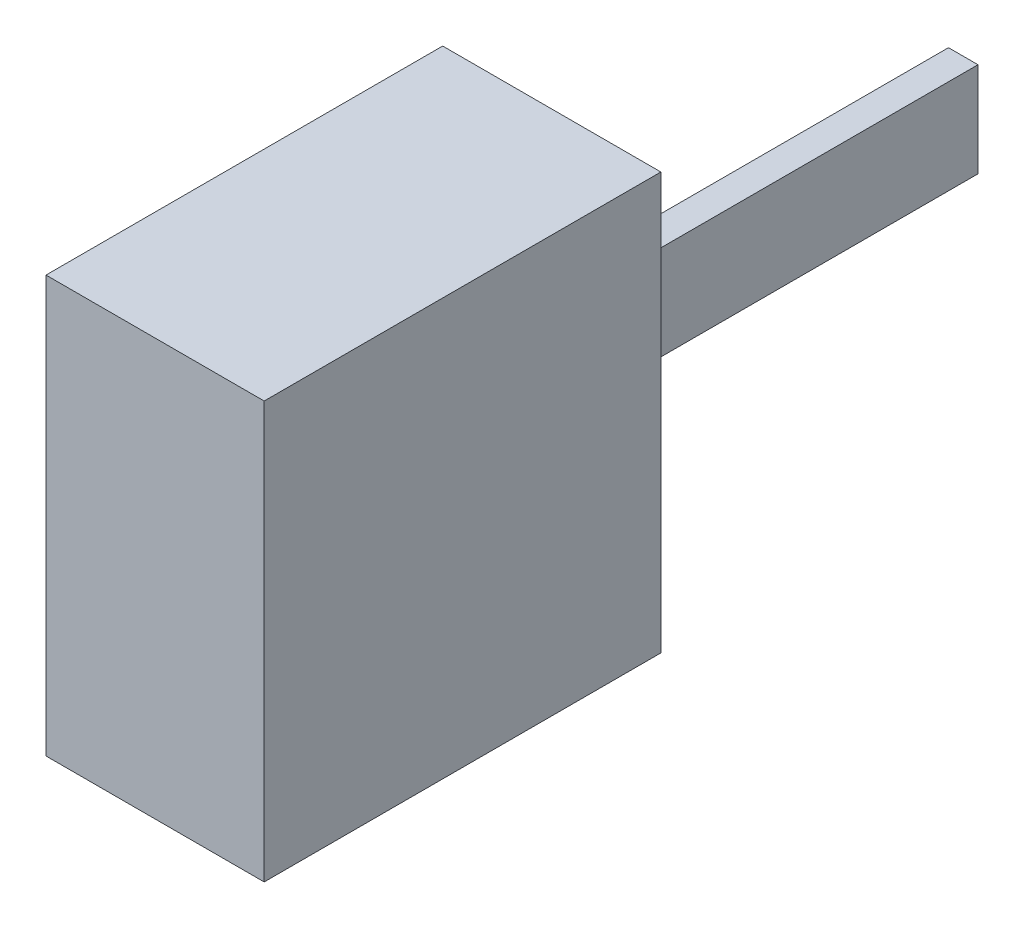
ISO-10303-21;
HEADER;
FILE_DESCRIPTION(('STEP AP214'),'2;1');
FILE_NAME('part.step','',(''),(''),'','','');
FILE_SCHEMA(('AUTOMOTIVE_DESIGN { 1 0 10303 214 1 1 1 1 }'));
ENDSEC;
DATA;
#1=APPLICATION_CONTEXT('core data for automotive mechanical design processes');
#2=APPLICATION_PROTOCOL_DEFINITION('international standard','automotive_design',2000,#1);
#3=PRODUCT_CONTEXT('',#1,'mechanical');
#4=PRODUCT('Part','Part','',(#3));
#5=PRODUCT_RELATED_PRODUCT_CATEGORY('part','',(#4));
#6=PRODUCT_DEFINITION_FORMATION('','',#4);
#7=PRODUCT_DEFINITION_CONTEXT('part definition',#1,'design');
#8=PRODUCT_DEFINITION('design','',#6,#7);
#9=PRODUCT_DEFINITION_SHAPE('','',#8);
#10=(LENGTH_UNIT() NAMED_UNIT(*) SI_UNIT(.MILLI.,.METRE.));
#11=(NAMED_UNIT(*) PLANE_ANGLE_UNIT() SI_UNIT($,.RADIAN.));
#12=(NAMED_UNIT(*) SI_UNIT($,.STERADIAN.) SOLID_ANGLE_UNIT());
#13=UNCERTAINTY_MEASURE_WITH_UNIT(LENGTH_MEASURE(1.E-05),#10,'distance_accuracy_value','');
#14=(GEOMETRIC_REPRESENTATION_CONTEXT(3) GLOBAL_UNCERTAINTY_ASSIGNED_CONTEXT((#13)) GLOBAL_UNIT_ASSIGNED_CONTEXT((#10,
#11,#12)) REPRESENTATION_CONTEXT('',''));
#15=CARTESIAN_POINT('',(0.,0.,0.));
#16=DIRECTION('',(0.,0.,1.));
#17=DIRECTION('',(1.,0.,0.));
#18=AXIS2_PLACEMENT_3D('',#15,#16,#17);
#19=CARTESIAN_POINT('',(0.,0.,0.));
#20=DIRECTION('',(0.,0.,1.));
#21=DIRECTION('',(1.,0.,0.));
#22=AXIS2_PLACEMENT_3D('',#19,#20,#21);
#23=PLANE('',#22);
#24=DIRECTION('',(0.,-1.,0.));
#25=VECTOR('',#24,1.);
#26=CARTESIAN_POINT('',(16.5,0.,0.));
#27=LINE('',#26,#25);
#28=CARTESIAN_POINT('',(16.5,25.875,0.));
#29=VERTEX_POINT('',#28);
#30=CARTESIAN_POINT('',(16.5,-37.125,0.));
#31=VERTEX_POINT('',#30);
#32=EDGE_CURVE('E138',#29,#31,#27,.T.);
#33=ORIENTED_EDGE('',*,*,#32,.T.);
#34=DIRECTION('',(1.,0.,0.));
#35=VECTOR('',#34,1.);
#36=CARTESIAN_POINT('',(0.,-37.125,0.));
#37=LINE('',#36,#35);
#38=CARTESIAN_POINT('',(-16.5,-37.125,0.));
#39=VERTEX_POINT('',#38);
#40=EDGE_CURVE('E145',#39,#31,#37,.T.);
#41=ORIENTED_EDGE('',*,*,#40,.F.);
#42=DIRECTION('',(0.,-1.,0.));
#43=VECTOR('',#42,1.);
#44=CARTESIAN_POINT('',(-16.5,0.,0.));
#45=LINE('',#44,#43);
#46=CARTESIAN_POINT('',(-16.5,25.875,0.));
#47=VERTEX_POINT('',#46);
#48=EDGE_CURVE('E156',#47,#39,#45,.T.);
#49=ORIENTED_EDGE('',*,*,#48,.F.);
#50=DIRECTION('',(1.,0.,0.));
#51=VECTOR('',#50,1.);
#52=CARTESIAN_POINT('',(0.,25.875,0.));
#53=LINE('',#52,#51);
#54=EDGE_CURVE('E153',#47,#29,#53,.T.);
#55=ORIENTED_EDGE('',*,*,#54,.T.);
#56=EDGE_LOOP('',(#33,#41,#49,#55));
#57=FACE_BOUND('',#56,.T.);
#58=DIRECTION('',(0.,1.,0.));
#59=VECTOR('',#58,1.);
#60=CARTESIAN_POINT('',(0.,0.,0.));
#61=LINE('',#60,#59);
#62=CARTESIAN_POINT('',(0.,-10.3850356055091,0.));
#63=VERTEX_POINT('',#62);
#64=CARTESIAN_POINT('',(0.,3.90882418656702,0.));
#65=VERTEX_POINT('',#64);
#66=EDGE_CURVE('E48',#63,#65,#61,.T.);
#67=ORIENTED_EDGE('',*,*,#66,.F.);
#68=DIRECTION('',(-1.,0.,0.));
#69=VECTOR('',#68,1.);
#70=CARTESIAN_POINT('',(0.,-10.3850356055091,0.));
#71=LINE('',#70,#69);
#72=CARTESIAN_POINT('',(4.46671585163472,-10.3850356055091,0.));
#73=VERTEX_POINT('',#72);
#74=EDGE_CURVE('E118',#73,#63,#71,.T.);
#75=ORIENTED_EDGE('',*,*,#74,.F.);
#76=DIRECTION('',(0.,1.,0.));
#77=VECTOR('',#76,1.);
#78=CARTESIAN_POINT('',(4.46671585163472,0.,0.));
#79=LINE('',#78,#77);
#80=CARTESIAN_POINT('',(4.46671585163472,3.90882418656702,0.));
#81=VERTEX_POINT('',#80);
#82=EDGE_CURVE('E128',#73,#81,#79,.T.);
#83=ORIENTED_EDGE('',*,*,#82,.T.);
#84=DIRECTION('',(-1.,0.,0.));
#85=VECTOR('',#84,1.);
#86=CARTESIAN_POINT('',(0.,3.90882418656702,0.));
#87=LINE('',#86,#85);
#88=EDGE_CURVE('E125',#81,#65,#87,.T.);
#89=ORIENTED_EDGE('',*,*,#88,.T.);
#90=EDGE_LOOP('',(#67,#75,#83,#89));
#91=FACE_BOUND('',#90,.T.);
#92=ADVANCED_FACE('F33',(#57,#91),#23,.F.);
#93=CARTESIAN_POINT('',(16.5,0.,60.));
#94=DIRECTION('',(1.,0.,0.));
#95=DIRECTION('',(0.,1.,0.));
#96=AXIS2_PLACEMENT_3D('',#93,#94,#95);
#97=PLANE('',#96);
#98=ORIENTED_EDGE('',*,*,#32,.F.);
#99=DIRECTION('',(0.,0.,-1.));
#100=VECTOR('',#99,1.);
#101=CARTESIAN_POINT('',(16.5,25.875,60.));
#102=LINE('',#101,#100);
#103=CARTESIAN_POINT('',(16.5,25.875,60.));
#104=VERTEX_POINT('',#103);
#105=EDGE_CURVE('E11',#104,#29,#102,.T.);
#106=ORIENTED_EDGE('',*,*,#105,.F.);
#107=DIRECTION('',(0.,-1.,0.));
#108=VECTOR('',#107,1.);
#109=CARTESIAN_POINT('',(16.5,0.,60.));
#110=LINE('',#109,#108);
#111=CARTESIAN_POINT('',(16.5,-37.125,60.));
#112=VERTEX_POINT('',#111);
#113=EDGE_CURVE('E142',#104,#112,#110,.T.);
#114=ORIENTED_EDGE('',*,*,#113,.T.);
#115=DIRECTION('',(0.,0.,-1.));
#116=VECTOR('',#115,1.);
#117=CARTESIAN_POINT('',(16.5,-37.125,60.));
#118=LINE('',#117,#116);
#119=EDGE_CURVE('E77',#112,#31,#118,.T.);
#120=ORIENTED_EDGE('',*,*,#119,.T.);
#121=EDGE_LOOP('',(#98,#106,#114,#120));
#122=FACE_BOUND('',#121,.T.);
#123=ADVANCED_FACE('F35',(#122),#97,.T.);
#124=CARTESIAN_POINT('',(0.,25.875,60.));
#125=DIRECTION('',(0.,1.,0.));
#126=DIRECTION('',(-1.,0.,0.));
#127=AXIS2_PLACEMENT_3D('',#124,#125,#126);
#128=PLANE('',#127);
#129=ORIENTED_EDGE('',*,*,#54,.F.);
#130=DIRECTION('',(0.,0.,-1.));
#131=VECTOR('',#130,1.);
#132=CARTESIAN_POINT('',(-16.5,25.875,60.));
#133=LINE('',#132,#131);
#134=CARTESIAN_POINT('',(-16.5,25.875,60.));
#135=VERTEX_POINT('',#134);
#136=EDGE_CURVE('E41',#135,#47,#133,.T.);
#137=ORIENTED_EDGE('',*,*,#136,.F.);
#138=DIRECTION('',(1.,0.,0.));
#139=VECTOR('',#138,1.);
#140=CARTESIAN_POINT('',(0.,25.875,60.));
#141=LINE('',#140,#139);
#142=EDGE_CURVE('E144',#135,#104,#141,.T.);
#143=ORIENTED_EDGE('',*,*,#142,.T.);
#144=ORIENTED_EDGE('',*,*,#105,.T.);
#145=EDGE_LOOP('',(#129,#137,#143,#144));
#146=FACE_BOUND('',#145,.T.);
#147=ADVANCED_FACE('F173',(#146),#128,.T.);
#148=CARTESIAN_POINT('',(-16.5,0.,60.));
#149=DIRECTION('',(1.,0.,0.));
#150=DIRECTION('',(0.,1.,0.));
#151=AXIS2_PLACEMENT_3D('',#148,#149,#150);
#152=PLANE('',#151);
#153=ORIENTED_EDGE('',*,*,#48,.T.);
#154=DIRECTION('',(0.,0.,-1.));
#155=VECTOR('',#154,1.);
#156=CARTESIAN_POINT('',(-16.5,-37.125,60.));
#157=LINE('',#156,#155);
#158=CARTESIAN_POINT('',(-16.5,-37.125,60.));
#159=VERTEX_POINT('',#158);
#160=EDGE_CURVE('E160',#159,#39,#157,.T.);
#161=ORIENTED_EDGE('',*,*,#160,.F.);
#162=DIRECTION('',(0.,-1.,0.));
#163=VECTOR('',#162,1.);
#164=CARTESIAN_POINT('',(-16.5,0.,60.));
#165=LINE('',#164,#163);
#166=EDGE_CURVE('E148',#135,#159,#165,.T.);
#167=ORIENTED_EDGE('',*,*,#166,.F.);
#168=ORIENTED_EDGE('',*,*,#136,.T.);
#169=EDGE_LOOP('',(#153,#161,#167,#168));
#170=FACE_BOUND('',#169,.T.);
#171=ADVANCED_FACE('F165',(#170),#152,.F.);
#172=CARTESIAN_POINT('',(0.,-37.125,60.));
#173=DIRECTION('',(0.,1.,0.));
#174=DIRECTION('',(-1.,0.,0.));
#175=AXIS2_PLACEMENT_3D('',#172,#173,#174);
#176=PLANE('',#175);
#177=ORIENTED_EDGE('',*,*,#40,.T.);
#178=ORIENTED_EDGE('',*,*,#119,.F.);
#179=DIRECTION('',(1.,0.,0.));
#180=VECTOR('',#179,1.);
#181=CARTESIAN_POINT('',(0.,-37.125,60.));
#182=LINE('',#181,#180);
#183=EDGE_CURVE('E57',#159,#112,#182,.T.);
#184=ORIENTED_EDGE('',*,*,#183,.F.);
#185=ORIENTED_EDGE('',*,*,#160,.T.);
#186=EDGE_LOOP('',(#177,#178,#184,#185));
#187=FACE_BOUND('',#186,.T.);
#188=ADVANCED_FACE('F186',(#187),#176,.F.);
#189=CARTESIAN_POINT('',(0.,0.,60.));
#190=DIRECTION('',(0.,0.,1.));
#191=DIRECTION('',(1.,0.,0.));
#192=AXIS2_PLACEMENT_3D('',#189,#190,#191);
#193=PLANE('',#192);
#194=ORIENTED_EDGE('',*,*,#113,.F.);
#195=ORIENTED_EDGE('',*,*,#142,.F.);
#196=ORIENTED_EDGE('',*,*,#166,.T.);
#197=ORIENTED_EDGE('',*,*,#183,.T.);
#198=EDGE_LOOP('',(#194,#195,#196,#197));
#199=FACE_BOUND('',#198,.T.);
#200=ADVANCED_FACE('F184',(#199),#193,.T.);
#201=CARTESIAN_POINT('',(0.,0.,-60.));
#202=DIRECTION('',(1.,0.,0.));
#203=DIRECTION('',(0.,0.,-1.));
#204=AXIS2_PLACEMENT_3D('',#201,#202,#203);
#205=PLANE('',#204);
#206=ORIENTED_EDGE('',*,*,#66,.T.);
#207=DIRECTION('',(0.,0.,1.));
#208=VECTOR('',#207,1.);
#209=CARTESIAN_POINT('',(0.,3.90882418656702,-60.));
#210=LINE('',#209,#208);
#211=CARTESIAN_POINT('',(0.,3.90882418656702,-60.));
#212=VERTEX_POINT('',#211);
#213=EDGE_CURVE('E123',#212,#65,#210,.T.);
#214=ORIENTED_EDGE('',*,*,#213,.F.);
#215=DIRECTION('',(0.,1.,0.));
#216=VECTOR('',#215,1.);
#217=CARTESIAN_POINT('',(0.,0.,-60.));
#218=LINE('',#217,#216);
#219=CARTESIAN_POINT('',(0.,-10.3850356055091,-60.));
#220=VERTEX_POINT('',#219);
#221=EDGE_CURVE('E110',#220,#212,#218,.T.);
#222=ORIENTED_EDGE('',*,*,#221,.F.);
#223=DIRECTION('',(0.,0.,1.));
#224=VECTOR('',#223,1.);
#225=CARTESIAN_POINT('',(0.,-10.3850356055091,-60.));
#226=LINE('',#225,#224);
#227=EDGE_CURVE('E115',#220,#63,#226,.T.);
#228=ORIENTED_EDGE('',*,*,#227,.T.);
#229=EDGE_LOOP('',(#206,#214,#222,#228));
#230=FACE_BOUND('',#229,.T.);
#231=ADVANCED_FACE('F122',(#230),#205,.F.);
#232=CARTESIAN_POINT('',(0.,3.90882418656702,-60.));
#233=DIRECTION('',(0.,1.,0.));
#234=DIRECTION('',(0.,0.,1.));
#235=AXIS2_PLACEMENT_3D('',#232,#233,#234);
#236=PLANE('',#235);
#237=ORIENTED_EDGE('',*,*,#88,.F.);
#238=DIRECTION('',(0.,0.,1.));
#239=VECTOR('',#238,1.);
#240=CARTESIAN_POINT('',(4.46671585163472,3.90882418656702,-60.));
#241=LINE('',#240,#239);
#242=CARTESIAN_POINT('',(4.46671585163472,3.90882418656702,-60.));
#243=VERTEX_POINT('',#242);
#244=EDGE_CURVE('E139',#243,#81,#241,.T.);
#245=ORIENTED_EDGE('',*,*,#244,.F.);
#246=DIRECTION('',(-1.,0.,0.));
#247=VECTOR('',#246,1.);
#248=CARTESIAN_POINT('',(0.,3.90882418656702,-60.));
#249=LINE('',#248,#247);
#250=EDGE_CURVE('E120',#243,#212,#249,.T.);
#251=ORIENTED_EDGE('',*,*,#250,.T.);
#252=ORIENTED_EDGE('',*,*,#213,.T.);
#253=EDGE_LOOP('',(#237,#245,#251,#252));
#254=FACE_BOUND('',#253,.T.);
#255=ADVANCED_FACE('F210',(#254),#236,.T.);
#256=CARTESIAN_POINT('',(4.46671585163472,0.,-60.));
#257=DIRECTION('',(1.,0.,0.));
#258=DIRECTION('',(0.,0.,-1.));
#259=AXIS2_PLACEMENT_3D('',#256,#257,#258);
#260=PLANE('',#259);
#261=ORIENTED_EDGE('',*,*,#82,.F.);
#262=DIRECTION('',(0.,0.,1.));
#263=VECTOR('',#262,1.);
#264=CARTESIAN_POINT('',(4.46671585163472,-10.3850356055091,-60.));
#265=LINE('',#264,#263);
#266=CARTESIAN_POINT('',(4.46671585163472,-10.3850356055091,-60.));
#267=VERTEX_POINT('',#266);
#268=EDGE_CURVE('E119',#267,#73,#265,.T.);
#269=ORIENTED_EDGE('',*,*,#268,.F.);
#270=DIRECTION('',(0.,1.,0.));
#271=VECTOR('',#270,1.);
#272=CARTESIAN_POINT('',(4.46671585163472,0.,-60.));
#273=LINE('',#272,#271);
#274=EDGE_CURVE('E112',#267,#243,#273,.T.);
#275=ORIENTED_EDGE('',*,*,#274,.T.);
#276=ORIENTED_EDGE('',*,*,#244,.T.);
#277=EDGE_LOOP('',(#261,#269,#275,#276));
#278=FACE_BOUND('',#277,.T.);
#279=ADVANCED_FACE('F216',(#278),#260,.T.);
#280=CARTESIAN_POINT('',(0.,-10.3850356055091,-60.));
#281=DIRECTION('',(0.,1.,0.));
#282=DIRECTION('',(0.,0.,1.));
#283=AXIS2_PLACEMENT_3D('',#280,#281,#282);
#284=PLANE('',#283);
#285=ORIENTED_EDGE('',*,*,#74,.T.);
#286=ORIENTED_EDGE('',*,*,#227,.F.);
#287=DIRECTION('',(-1.,0.,0.));
#288=VECTOR('',#287,1.);
#289=CARTESIAN_POINT('',(0.,-10.3850356055091,-60.));
#290=LINE('',#289,#288);
#291=EDGE_CURVE('E105',#267,#220,#290,.T.);
#292=ORIENTED_EDGE('',*,*,#291,.F.);
#293=ORIENTED_EDGE('',*,*,#268,.T.);
#294=EDGE_LOOP('',(#285,#286,#292,#293));
#295=FACE_BOUND('',#294,.T.);
#296=ADVANCED_FACE('F116',(#295),#284,.F.);
#297=CARTESIAN_POINT('',(0.,0.,-60.));
#298=DIRECTION('',(0.,0.,1.));
#299=DIRECTION('',(1.,0.,0.));
#300=AXIS2_PLACEMENT_3D('',#297,#298,#299);
#301=PLANE('',#300);
#302=ORIENTED_EDGE('',*,*,#221,.T.);
#303=ORIENTED_EDGE('',*,*,#250,.F.);
#304=ORIENTED_EDGE('',*,*,#274,.F.);
#305=ORIENTED_EDGE('',*,*,#291,.T.);
#306=EDGE_LOOP('',(#302,#303,#304,#305));
#307=FACE_BOUND('',#306,.T.);
#308=ADVANCED_FACE('F107',(#307),#301,.F.);
#309=CLOSED_SHELL('',(#92,#123,#147,#171,#188,#200,#231,#255,#279,#296,#308));
#310=MANIFOLD_SOLID_BREP('B2',#309);
#311=ADVANCED_BREP_SHAPE_REPRESENTATION('',(#18,#310),#14);
#312=SHAPE_DEFINITION_REPRESENTATION(#9,#311);
ENDSEC;
END-ISO-10303-21;
